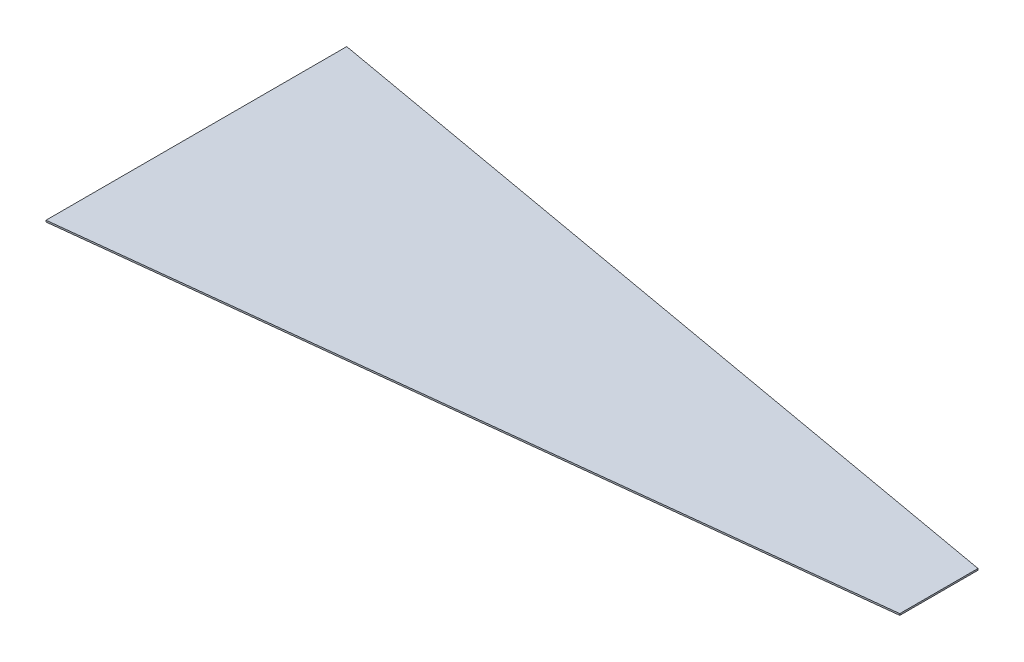
ISO-10303-21;
HEADER;
FILE_DESCRIPTION(('STEP AP214'),'2;1');
FILE_NAME('part.step','',(''),(''),'','','');
FILE_SCHEMA(('AUTOMOTIVE_DESIGN { 1 0 10303 214 1 1 1 1 }'));
ENDSEC;
DATA;
#1=APPLICATION_CONTEXT('core data for automotive mechanical design processes');
#2=APPLICATION_PROTOCOL_DEFINITION('international standard','automotive_design',2000,#1);
#3=PRODUCT_CONTEXT('',#1,'mechanical');
#4=PRODUCT('Part','Part','',(#3));
#5=PRODUCT_RELATED_PRODUCT_CATEGORY('part','',(#4));
#6=PRODUCT_DEFINITION_FORMATION('','',#4);
#7=PRODUCT_DEFINITION_CONTEXT('part definition',#1,'design');
#8=PRODUCT_DEFINITION('design','',#6,#7);
#9=PRODUCT_DEFINITION_SHAPE('','',#8);
#10=(LENGTH_UNIT() NAMED_UNIT(*) SI_UNIT(.MILLI.,.METRE.));
#11=(NAMED_UNIT(*) PLANE_ANGLE_UNIT() SI_UNIT($,.RADIAN.));
#12=(NAMED_UNIT(*) SI_UNIT($,.STERADIAN.) SOLID_ANGLE_UNIT());
#13=UNCERTAINTY_MEASURE_WITH_UNIT(LENGTH_MEASURE(1.E-05),#10,'distance_accuracy_value','');
#14=(GEOMETRIC_REPRESENTATION_CONTEXT(3) GLOBAL_UNCERTAINTY_ASSIGNED_CONTEXT((#13)) GLOBAL_UNIT_ASSIGNED_CONTEXT((#10,
#11,#12)) REPRESENTATION_CONTEXT('',''));
#15=CARTESIAN_POINT('',(0.,0.,0.));
#16=DIRECTION('',(0.,0.,1.));
#17=DIRECTION('',(1.,0.,0.));
#18=AXIS2_PLACEMENT_3D('',#15,#16,#17);
#19=CARTESIAN_POINT('',(0.,2.54,241.3));
#20=DIRECTION('',(-0.111616605798379,0.,-0.99375134380289));
#21=DIRECTION('',(-0.99375134380289,0.,0.111616605798379));
#22=AXIS2_PLACEMENT_3D('',#19,#20,#21);
#23=PLANE('',#22);
#24=DIRECTION('',(0.99375134380289,0.,-0.111616605798379));
#25=VECTOR('',#24,1.);
#26=CARTESIAN_POINT('',(0.,0.,241.3));
#27=LINE('',#26,#25);
#28=CARTESIAN_POINT('',(0.,0.,241.3));
#29=VERTEX_POINT('',#28);
#30=CARTESIAN_POINT('',(1231.9,0.,102.934907423787));
#31=VERTEX_POINT('',#30);
#32=EDGE_CURVE('E102',#29,#31,#27,.T.);
#33=ORIENTED_EDGE('',*,*,#32,.T.);
#34=DIRECTION('',(0.,-1.,0.));
#35=VECTOR('',#34,1.);
#36=CARTESIAN_POINT('',(1231.9,2.54,102.934907423787));
#37=LINE('',#36,#35);
#38=CARTESIAN_POINT('',(1231.9,2.54,102.934907423787));
#39=VERTEX_POINT('',#38);
#40=EDGE_CURVE('E11',#39,#31,#37,.T.);
#41=ORIENTED_EDGE('',*,*,#40,.F.);
#42=DIRECTION('',(0.99375134380289,0.,-0.111616605798379));
#43=VECTOR('',#42,1.);
#44=CARTESIAN_POINT('',(0.,2.54,241.3));
#45=LINE('',#44,#43);
#46=CARTESIAN_POINT('',(0.,2.54,241.3));
#47=VERTEX_POINT('',#46);
#48=EDGE_CURVE('E79',#47,#39,#45,.T.);
#49=ORIENTED_EDGE('',*,*,#48,.F.);
#50=DIRECTION('',(0.,-1.,0.));
#51=VECTOR('',#50,1.);
#52=CARTESIAN_POINT('',(0.,2.54,241.3));
#53=LINE('',#52,#51);
#54=EDGE_CURVE('E55',#47,#29,#53,.T.);
#55=ORIENTED_EDGE('',*,*,#54,.T.);
#56=EDGE_LOOP('',(#33,#41,#49,#55));
#57=FACE_BOUND('',#56,.T.);
#58=ADVANCED_FACE('F39',(#57),#23,.F.);
#59=CARTESIAN_POINT('',(1231.9,2.54,-22.5410925762129));
#60=DIRECTION('',(1.,0.,0.));
#61=DIRECTION('',(0.,0.,-1.));
#62=AXIS2_PLACEMENT_3D('',#59,#60,#61);
#63=PLANE('',#62);
#64=DIRECTION('',(0.,0.,1.));
#65=VECTOR('',#64,1.);
#66=CARTESIAN_POINT('',(1231.9,0.,-22.5410925762129));
#67=LINE('',#66,#65);
#68=CARTESIAN_POINT('',(1231.9,0.,-22.5410925762129));
#69=VERTEX_POINT('',#68);
#70=EDGE_CURVE('E88',#69,#31,#67,.T.);
#71=ORIENTED_EDGE('',*,*,#70,.F.);
#72=DIRECTION('',(0.,-1.,0.));
#73=VECTOR('',#72,1.);
#74=CARTESIAN_POINT('',(1231.9,2.54,-22.5410925762129));
#75=LINE('',#74,#73);
#76=CARTESIAN_POINT('',(1231.9,2.54,-22.5410925762129));
#77=VERTEX_POINT('',#76);
#78=EDGE_CURVE('E47',#77,#69,#75,.T.);
#79=ORIENTED_EDGE('',*,*,#78,.F.);
#80=DIRECTION('',(0.,0.,1.));
#81=VECTOR('',#80,1.);
#82=CARTESIAN_POINT('',(1231.9,2.54,-22.5410925762129));
#83=LINE('',#82,#81);
#84=EDGE_CURVE('E86',#77,#39,#83,.T.);
#85=ORIENTED_EDGE('',*,*,#84,.T.);
#86=ORIENTED_EDGE('',*,*,#40,.T.);
#87=EDGE_LOOP('',(#71,#79,#85,#86));
#88=FACE_BOUND('',#87,.T.);
#89=ADVANCED_FACE('F85',(#88),#63,.T.);
#90=CARTESIAN_POINT('',(0.,2.54,-241.3));
#91=DIRECTION('',(0.174843098248555,0.,-0.984596308643723));
#92=DIRECTION('',(-0.984596308643723,0.,-0.174843098248555));
#93=AXIS2_PLACEMENT_3D('',#90,#91,#92);
#94=PLANE('',#93);
#95=DIRECTION('',(0.984596308643723,0.,0.174843098248555));
#96=VECTOR('',#95,1.);
#97=CARTESIAN_POINT('',(0.,0.,-241.3));
#98=LINE('',#97,#96);
#99=CARTESIAN_POINT('',(0.,0.,-241.3));
#100=VERTEX_POINT('',#99);
#101=EDGE_CURVE('E105',#100,#69,#98,.T.);
#102=ORIENTED_EDGE('',*,*,#101,.F.);
#103=DIRECTION('',(0.,-1.,0.));
#104=VECTOR('',#103,1.);
#105=CARTESIAN_POINT('',(0.,2.54,-241.3));
#106=LINE('',#105,#104);
#107=CARTESIAN_POINT('',(0.,2.54,-241.3));
#108=VERTEX_POINT('',#107);
#109=EDGE_CURVE('E68',#108,#100,#106,.T.);
#110=ORIENTED_EDGE('',*,*,#109,.F.);
#111=DIRECTION('',(0.984596308643723,0.,0.174843098248555));
#112=VECTOR('',#111,1.);
#113=CARTESIAN_POINT('',(0.,2.54,-241.3));
#114=LINE('',#113,#112);
#115=EDGE_CURVE('E94',#108,#77,#114,.T.);
#116=ORIENTED_EDGE('',*,*,#115,.T.);
#117=ORIENTED_EDGE('',*,*,#78,.T.);
#118=EDGE_LOOP('',(#102,#110,#116,#117));
#119=FACE_BOUND('',#118,.T.);
#120=ADVANCED_FACE('F96',(#119),#94,.T.);
#121=CARTESIAN_POINT('',(0.,2.54,241.3));
#122=DIRECTION('',(-1.,0.,0.));
#123=DIRECTION('',(0.,0.,1.));
#124=AXIS2_PLACEMENT_3D('',#121,#122,#123);
#125=PLANE('',#124);
#126=DIRECTION('',(0.,0.,-1.));
#127=VECTOR('',#126,1.);
#128=CARTESIAN_POINT('',(0.,0.,241.3));
#129=LINE('',#128,#127);
#130=EDGE_CURVE('E107',#29,#100,#129,.T.);
#131=ORIENTED_EDGE('',*,*,#130,.F.);
#132=ORIENTED_EDGE('',*,*,#54,.F.);
#133=DIRECTION('',(0.,0.,-1.));
#134=VECTOR('',#133,1.);
#135=CARTESIAN_POINT('',(0.,2.54,241.3));
#136=LINE('',#135,#134);
#137=EDGE_CURVE('E97',#47,#108,#136,.T.);
#138=ORIENTED_EDGE('',*,*,#137,.T.);
#139=ORIENTED_EDGE('',*,*,#109,.T.);
#140=EDGE_LOOP('',(#131,#132,#138,#139));
#141=FACE_BOUND('',#140,.T.);
#142=ADVANCED_FACE('F113',(#141),#125,.T.);
#143=CARTESIAN_POINT('',(0.,2.54,0.));
#144=DIRECTION('',(0.,-1.,0.));
#145=DIRECTION('',(0.,0.,-1.));
#146=AXIS2_PLACEMENT_3D('',#143,#144,#145);
#147=PLANE('',#146);
#148=ORIENTED_EDGE('',*,*,#48,.T.);
#149=ORIENTED_EDGE('',*,*,#84,.F.);
#150=ORIENTED_EDGE('',*,*,#115,.F.);
#151=ORIENTED_EDGE('',*,*,#137,.F.);
#152=EDGE_LOOP('',(#148,#149,#150,#151));
#153=FACE_BOUND('',#152,.T.);
#154=ADVANCED_FACE('F93',(#153),#147,.F.);
#155=CARTESIAN_POINT('',(0.,0.,0.));
#156=DIRECTION('',(0.,-1.,0.));
#157=DIRECTION('',(0.,0.,-1.));
#158=AXIS2_PLACEMENT_3D('',#155,#156,#157);
#159=PLANE('',#158);
#160=ORIENTED_EDGE('',*,*,#32,.F.);
#161=ORIENTED_EDGE('',*,*,#130,.T.);
#162=ORIENTED_EDGE('',*,*,#101,.T.);
#163=ORIENTED_EDGE('',*,*,#70,.T.);
#164=EDGE_LOOP('',(#160,#161,#162,#163));
#165=FACE_BOUND('',#164,.T.);
#166=ADVANCED_FACE('F112',(#165),#159,.T.);
#167=CLOSED_SHELL('',(#58,#89,#120,#142,#154,#166));
#168=MANIFOLD_SOLID_BREP('B2',#167);
#169=ADVANCED_BREP_SHAPE_REPRESENTATION('',(#18,#168),#14);
#170=SHAPE_DEFINITION_REPRESENTATION(#9,#169);
ENDSEC;
END-ISO-10303-21;
